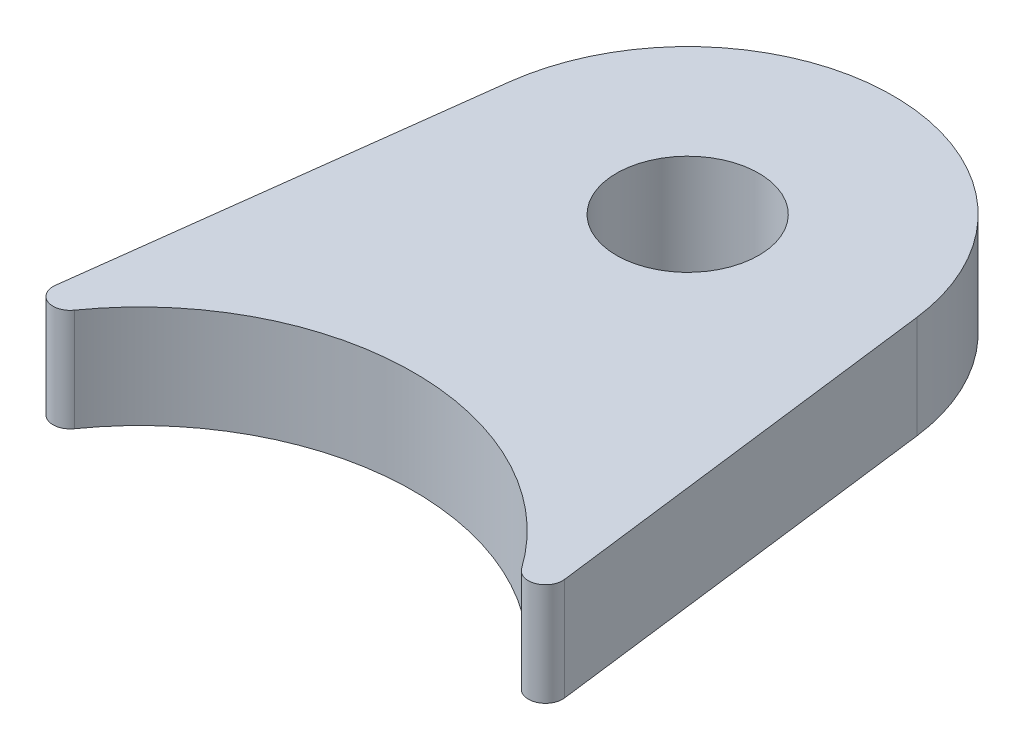
ISO-10303-21;
HEADER;
FILE_DESCRIPTION(('STEP AP214'),'2;1');
FILE_NAME('part.step','',(''),(''),'','','');
FILE_SCHEMA(('AUTOMOTIVE_DESIGN { 1 0 10303 214 1 1 1 1 }'));
ENDSEC;
DATA;
#1=APPLICATION_CONTEXT('core data for automotive mechanical design processes');
#2=APPLICATION_PROTOCOL_DEFINITION('international standard','automotive_design',2000,#1);
#3=PRODUCT_CONTEXT('',#1,'mechanical');
#4=PRODUCT('Part','Part','',(#3));
#5=PRODUCT_RELATED_PRODUCT_CATEGORY('part','',(#4));
#6=PRODUCT_DEFINITION_FORMATION('','',#4);
#7=PRODUCT_DEFINITION_CONTEXT('part definition',#1,'design');
#8=PRODUCT_DEFINITION('design','',#6,#7);
#9=PRODUCT_DEFINITION_SHAPE('','',#8);
#10=(LENGTH_UNIT() NAMED_UNIT(*) SI_UNIT(.MILLI.,.METRE.));
#11=(NAMED_UNIT(*) PLANE_ANGLE_UNIT() SI_UNIT($,.RADIAN.));
#12=(NAMED_UNIT(*) SI_UNIT($,.STERADIAN.) SOLID_ANGLE_UNIT());
#13=UNCERTAINTY_MEASURE_WITH_UNIT(LENGTH_MEASURE(1.E-05),#10,'distance_accuracy_value','');
#14=(GEOMETRIC_REPRESENTATION_CONTEXT(3) GLOBAL_UNCERTAINTY_ASSIGNED_CONTEXT((#13)) GLOBAL_UNIT_ASSIGNED_CONTEXT((#10,
#11,#12)) REPRESENTATION_CONTEXT('',''));
#15=CARTESIAN_POINT('',(0.,0.,0.));
#16=DIRECTION('',(0.,0.,1.));
#17=DIRECTION('',(1.,0.,0.));
#18=AXIS2_PLACEMENT_3D('',#15,#16,#17);
#19=CARTESIAN_POINT('',(0.,4.7625,-25.4));
#20=DIRECTION('',(0.,-1.,0.));
#21=DIRECTION('',(0.,0.,-1.));
#22=AXIS2_PLACEMENT_3D('',#19,#20,#21);
#23=CYLINDRICAL_SURFACE('',#22,9.525);
#24=CARTESIAN_POINT('',(0.,0.,-25.4));
#25=DIRECTION('',(0.,1.,0.));
#26=DIRECTION('',(0.,0.,1.));
#27=AXIS2_PLACEMENT_3D('',#24,#25,#26);
#28=CIRCLE('',#27,9.525);
#29=CARTESIAN_POINT('',(9.45029296420883,0.,-26.590625));
#30=VERTEX_POINT('',#29);
#31=CARTESIAN_POINT('',(-9.45029296420883,0.,-26.590625));
#32=VERTEX_POINT('',#31);
#33=EDGE_CURVE('E113',#30,#32,#28,.T.);
#34=ORIENTED_EDGE('',*,*,#33,.T.);
#35=DIRECTION('',(0.,-1.,0.));
#36=VECTOR('',#35,1.);
#37=CARTESIAN_POINT('',(-9.45029296420883,4.7625,-26.590625));
#38=LINE('',#37,#36);
#39=CARTESIAN_POINT('',(-9.45029296420883,4.7625,-26.590625));
#40=VERTEX_POINT('',#39);
#41=EDGE_CURVE('E98',#40,#32,#38,.T.);
#42=ORIENTED_EDGE('',*,*,#41,.F.);
#43=CARTESIAN_POINT('',(0.,4.7625,-25.4));
#44=DIRECTION('',(0.,1.,0.));
#45=DIRECTION('',(0.,0.,1.));
#46=AXIS2_PLACEMENT_3D('',#43,#44,#45);
#47=CIRCLE('',#46,9.525);
#48=CARTESIAN_POINT('',(9.45029296420883,4.7625,-26.590625));
#49=VERTEX_POINT('',#48);
#50=EDGE_CURVE('E101',#49,#40,#47,.T.);
#51=ORIENTED_EDGE('',*,*,#50,.F.);
#52=DIRECTION('',(0.,-1.,0.));
#53=VECTOR('',#52,1.);
#54=CARTESIAN_POINT('',(9.45029296420883,4.7625,-26.590625));
#55=LINE('',#54,#53);
#56=EDGE_CURVE('E115',#49,#30,#55,.T.);
#57=ORIENTED_EDGE('',*,*,#56,.T.);
#58=EDGE_LOOP('',(#34,#42,#51,#57));
#59=FACE_BOUND('',#58,.T.);
#60=ADVANCED_FACE('F43',(#59),#23,.T.);
#61=CARTESIAN_POINT('',(-12.6003906189451,4.7625,-1.5875));
#62=DIRECTION('',(-0.992156741649221,0.,-0.125));
#63=DIRECTION('',(-0.125,0.,0.992156741649222));
#64=AXIS2_PLACEMENT_3D('',#61,#62,#63);
#65=PLANE('',#64);
#66=DIRECTION('',(0.125,0.,-0.992156741649222));
#67=VECTOR('',#66,1.);
#68=CARTESIAN_POINT('',(-12.6003906189451,0.,-1.5875));
#69=LINE('',#68,#67);
#70=CARTESIAN_POINT('',(-11.8066406189451,0.,-7.88769530947256));
#71=VERTEX_POINT('',#70);
#72=EDGE_CURVE('E148',#71,#32,#69,.T.);
#73=ORIENTED_EDGE('',*,*,#72,.F.);
#74=DIRECTION('',(0.,-1.,0.));
#75=VECTOR('',#74,1.);
#76=CARTESIAN_POINT('',(-11.8066406189451,4.7625,-7.88769530947256));
#77=LINE('',#76,#75);
#78=CARTESIAN_POINT('',(-11.8066406189451,4.7625,-7.88769530947256));
#79=VERTEX_POINT('',#78);
#80=EDGE_CURVE('E11',#71,#79,#77,.F.);
#81=ORIENTED_EDGE('',*,*,#80,.T.);
#82=DIRECTION('',(0.125,0.,-0.992156741649222));
#83=VECTOR('',#82,1.);
#84=CARTESIAN_POINT('',(-12.6003906189451,4.7625,-1.5875));
#85=LINE('',#84,#83);
#86=EDGE_CURVE('E94',#79,#40,#85,.T.);
#87=ORIENTED_EDGE('',*,*,#86,.T.);
#88=ORIENTED_EDGE('',*,*,#41,.T.);
#89=EDGE_LOOP('',(#73,#81,#87,#88));
#90=FACE_BOUND('',#89,.T.);
#91=ADVANCED_FACE('F96',(#90),#65,.T.);
#92=CARTESIAN_POINT('',(0.,4.7625,0.));
#93=DIRECTION('',(0.,-1.,0.));
#94=DIRECTION('',(0.,0.,-1.));
#95=AXIS2_PLACEMENT_3D('',#92,#93,#94);
#96=CYLINDRICAL_SURFACE('',#95,12.7);
#97=CARTESIAN_POINT('',(0.,0.,0.));
#98=DIRECTION('',(0.,1.,0.));
#99=DIRECTION('',(0.,0.,1.));
#100=AXIS2_PLACEMENT_3D('',#97,#98,#99);
#101=CIRCLE('',#100,12.7);
#102=CARTESIAN_POINT('',(10.3709328990692,0.,-7.33033087950358));
#103=VERTEX_POINT('',#102);
#104=CARTESIAN_POINT('',(-10.3709328990692,0.,-7.33033087950358));
#105=VERTEX_POINT('',#104);
#106=EDGE_CURVE('E144',#103,#105,#101,.T.);
#107=ORIENTED_EDGE('',*,*,#106,.F.);
#108=DIRECTION('',(0.,-1.,0.));
#109=VECTOR('',#108,1.);
#110=CARTESIAN_POINT('',(10.3709328990692,4.7625,-7.33033087950358));
#111=LINE('',#110,#109);
#112=CARTESIAN_POINT('',(10.3709328990692,4.7625,-7.33033087950358));
#113=VERTEX_POINT('',#112);
#114=EDGE_CURVE('E129',#103,#113,#111,.F.);
#115=ORIENTED_EDGE('',*,*,#114,.T.);
#116=CARTESIAN_POINT('',(0.,4.7625,0.));
#117=DIRECTION('',(0.,1.,0.));
#118=DIRECTION('',(0.,0.,1.));
#119=AXIS2_PLACEMENT_3D('',#116,#117,#118);
#120=CIRCLE('',#119,12.7);
#121=CARTESIAN_POINT('',(-10.3709328990692,4.7625,-7.33033087950358));
#122=VERTEX_POINT('',#121);
#123=EDGE_CURVE('E100',#113,#122,#120,.T.);
#124=ORIENTED_EDGE('',*,*,#123,.T.);
#125=DIRECTION('',(0.,-1.,0.));
#126=VECTOR('',#125,1.);
#127=CARTESIAN_POINT('',(-10.3709328990692,4.7625,-7.33033087950358));
#128=LINE('',#127,#126);
#129=EDGE_CURVE('E126',#122,#105,#128,.T.);
#130=ORIENTED_EDGE('',*,*,#129,.T.);
#131=EDGE_LOOP('',(#107,#115,#124,#130));
#132=FACE_BOUND('',#131,.T.);
#133=ADVANCED_FACE('F146',(#132),#96,.F.);
#134=CARTESIAN_POINT('',(12.6003906189451,4.7625,-1.5875));
#135=DIRECTION('',(-0.992156741649221,0.,0.125));
#136=DIRECTION('',(0.125,0.,0.992156741649222));
#137=AXIS2_PLACEMENT_3D('',#134,#135,#136);
#138=PLANE('',#137);
#139=DIRECTION('',(-0.125,0.,-0.992156741649222));
#140=VECTOR('',#139,1.);
#141=CARTESIAN_POINT('',(12.6003906189451,4.7625,-1.5875));
#142=LINE('',#141,#140);
#143=CARTESIAN_POINT('',(11.8066406189451,4.7625,-7.88769530947256));
#144=VERTEX_POINT('',#143);
#145=EDGE_CURVE('E106',#144,#49,#142,.T.);
#146=ORIENTED_EDGE('',*,*,#145,.F.);
#147=DIRECTION('',(0.,1.,0.));
#148=VECTOR('',#147,1.);
#149=CARTESIAN_POINT('',(11.8066406189451,0.,-7.88769530947256));
#150=LINE('',#149,#148);
#151=CARTESIAN_POINT('',(11.8066406189451,0.,-7.88769530947256));
#152=VERTEX_POINT('',#151);
#153=EDGE_CURVE('E114',#144,#152,#150,.F.);
#154=ORIENTED_EDGE('',*,*,#153,.T.);
#155=DIRECTION('',(-0.125,0.,-0.992156741649222));
#156=VECTOR('',#155,1.);
#157=CARTESIAN_POINT('',(12.6003906189451,0.,-1.5875));
#158=LINE('',#157,#156);
#159=EDGE_CURVE('E110',#152,#30,#158,.T.);
#160=ORIENTED_EDGE('',*,*,#159,.T.);
#161=ORIENTED_EDGE('',*,*,#56,.F.);
#162=EDGE_LOOP('',(#146,#154,#160,#161));
#163=FACE_BOUND('',#162,.T.);
#164=ADVANCED_FACE('F136',(#163),#138,.F.);
#165=CARTESIAN_POINT('',(0.,4.7625,0.));
#166=DIRECTION('',(0.,1.,0.));
#167=DIRECTION('',(0.,0.,1.));
#168=AXIS2_PLACEMENT_3D('',#165,#166,#167);
#169=PLANE('',#168);
#170=CARTESIAN_POINT('',(0.,4.7625,-25.4));
#171=DIRECTION('',(0.,1.,0.));
#172=DIRECTION('',(0.,0.,1.));
#173=AXIS2_PLACEMENT_3D('',#170,#171,#172);
#174=CIRCLE('',#173,3.3);
#175=CARTESIAN_POINT('',(0.,4.7625,-22.1));
#176=VERTEX_POINT('',#175);
#177=EDGE_CURVE('E157',#176,#176,#174,.T.);
#178=ORIENTED_EDGE('',*,*,#177,.F.);
#179=EDGE_LOOP('',(#178));
#180=FACE_BOUND('',#179,.T.);
#181=ORIENTED_EDGE('',*,*,#123,.F.);
#182=CARTESIAN_POINT('',(11.019116205261,4.7625,-7.78847655947256));
#183=DIRECTION('',(0.,1.,0.));
#184=DIRECTION('',(0.,0.,1.));
#185=AXIS2_PLACEMENT_3D('',#182,#183,#184);
#186=CIRCLE('',#185,0.79375);
#187=EDGE_CURVE('E51',#113,#144,#186,.T.);
#188=ORIENTED_EDGE('',*,*,#187,.T.);
#189=ORIENTED_EDGE('',*,*,#145,.T.);
#190=ORIENTED_EDGE('',*,*,#50,.T.);
#191=ORIENTED_EDGE('',*,*,#86,.F.);
#192=CARTESIAN_POINT('',(-11.019116205261,4.7625,-7.78847655947256));
#193=DIRECTION('',(0.,1.,0.));
#194=DIRECTION('',(0.,0.,1.));
#195=AXIS2_PLACEMENT_3D('',#192,#193,#194);
#196=CIRCLE('',#195,0.79375);
#197=EDGE_CURVE('E63',#79,#122,#196,.T.);
#198=ORIENTED_EDGE('',*,*,#197,.T.);
#199=EDGE_LOOP('',(#181,#188,#189,#190,#191,#198));
#200=FACE_BOUND('',#199,.T.);
#201=ADVANCED_FACE('F104',(#180,#200),#169,.T.);
#202=CARTESIAN_POINT('',(0.,0.,0.));
#203=DIRECTION('',(0.,1.,0.));
#204=DIRECTION('',(0.,0.,1.));
#205=AXIS2_PLACEMENT_3D('',#202,#203,#204);
#206=PLANE('',#205);
#207=CARTESIAN_POINT('',(0.,0.,-25.4));
#208=DIRECTION('',(0.,1.,0.));
#209=DIRECTION('',(0.,0.,1.));
#210=AXIS2_PLACEMENT_3D('',#207,#208,#209);
#211=CIRCLE('',#210,3.3);
#212=CARTESIAN_POINT('',(0.,0.,-22.1));
#213=VERTEX_POINT('',#212);
#214=EDGE_CURVE('E152',#213,#213,#211,.T.);
#215=ORIENTED_EDGE('',*,*,#214,.T.);
#216=EDGE_LOOP('',(#215));
#217=FACE_BOUND('',#216,.T.);
#218=ORIENTED_EDGE('',*,*,#159,.F.);
#219=CARTESIAN_POINT('',(11.019116205261,0.,-7.78847655947256));
#220=DIRECTION('',(0.,1.,0.));
#221=DIRECTION('',(0.,0.,1.));
#222=AXIS2_PLACEMENT_3D('',#219,#220,#221);
#223=CIRCLE('',#222,0.79375);
#224=EDGE_CURVE('E124',#152,#103,#223,.F.);
#225=ORIENTED_EDGE('',*,*,#224,.T.);
#226=ORIENTED_EDGE('',*,*,#106,.T.);
#227=CARTESIAN_POINT('',(-11.019116205261,0.,-7.78847655947256));
#228=DIRECTION('',(0.,1.,0.));
#229=DIRECTION('',(0.,0.,1.));
#230=AXIS2_PLACEMENT_3D('',#227,#228,#229);
#231=CIRCLE('',#230,0.79375);
#232=EDGE_CURVE('E118',#105,#71,#231,.F.);
#233=ORIENTED_EDGE('',*,*,#232,.T.);
#234=ORIENTED_EDGE('',*,*,#72,.T.);
#235=ORIENTED_EDGE('',*,*,#33,.F.);
#236=EDGE_LOOP('',(#218,#225,#226,#233,#234,#235));
#237=FACE_BOUND('',#236,.T.);
#238=ADVANCED_FACE('F143',(#217,#237),#206,.F.);
#239=CARTESIAN_POINT('',(11.019116205261,4.7625,-7.78847655947256));
#240=DIRECTION('',(0.,-1.,0.));
#241=DIRECTION('',(0.,0.,-1.));
#242=AXIS2_PLACEMENT_3D('',#239,#240,#241);
#243=CYLINDRICAL_SURFACE('',#242,0.79375);
#244=ORIENTED_EDGE('',*,*,#187,.F.);
#245=ORIENTED_EDGE('',*,*,#114,.F.);
#246=ORIENTED_EDGE('',*,*,#224,.F.);
#247=ORIENTED_EDGE('',*,*,#153,.F.);
#248=EDGE_LOOP('',(#244,#245,#246,#247));
#249=FACE_BOUND('',#248,.T.);
#250=ADVANCED_FACE('F139',(#249),#243,.T.);
#251=CARTESIAN_POINT('',(-11.019116205261,4.7625,-7.78847655947256));
#252=DIRECTION('',(0.,-1.,0.));
#253=DIRECTION('',(0.,0.,-1.));
#254=AXIS2_PLACEMENT_3D('',#251,#252,#253);
#255=CYLINDRICAL_SURFACE('',#254,0.79375);
#256=ORIENTED_EDGE('',*,*,#197,.F.);
#257=ORIENTED_EDGE('',*,*,#80,.F.);
#258=ORIENTED_EDGE('',*,*,#232,.F.);
#259=ORIENTED_EDGE('',*,*,#129,.F.);
#260=EDGE_LOOP('',(#256,#257,#258,#259));
#261=FACE_BOUND('',#260,.T.);
#262=ADVANCED_FACE('F45',(#261),#255,.T.);
#263=CARTESIAN_POINT('',(0.,4.7625,-25.4));
#264=DIRECTION('',(0.,1.,0.));
#265=DIRECTION('',(0.,0.,1.));
#266=AXIS2_PLACEMENT_3D('',#263,#264,#265);
#267=CYLINDRICAL_SURFACE('',#266,3.3);
#268=ORIENTED_EDGE('',*,*,#214,.F.);
#269=EDGE_LOOP('',(#268));
#270=FACE_BOUND('',#269,.T.);
#271=ORIENTED_EDGE('',*,*,#177,.T.);
#272=EDGE_LOOP('',(#271));
#273=FACE_BOUND('',#272,.T.);
#274=ADVANCED_FACE('F161',(#270,#273),#267,.F.);
#275=CLOSED_SHELL('',(#60,#91,#133,#164,#201,#238,#250,#262,#274));
#276=MANIFOLD_SOLID_BREP('B2',#275);
#277=ADVANCED_BREP_SHAPE_REPRESENTATION('',(#18,#276),#14);
#278=SHAPE_DEFINITION_REPRESENTATION(#9,#277);
ENDSEC;
END-ISO-10303-21;
